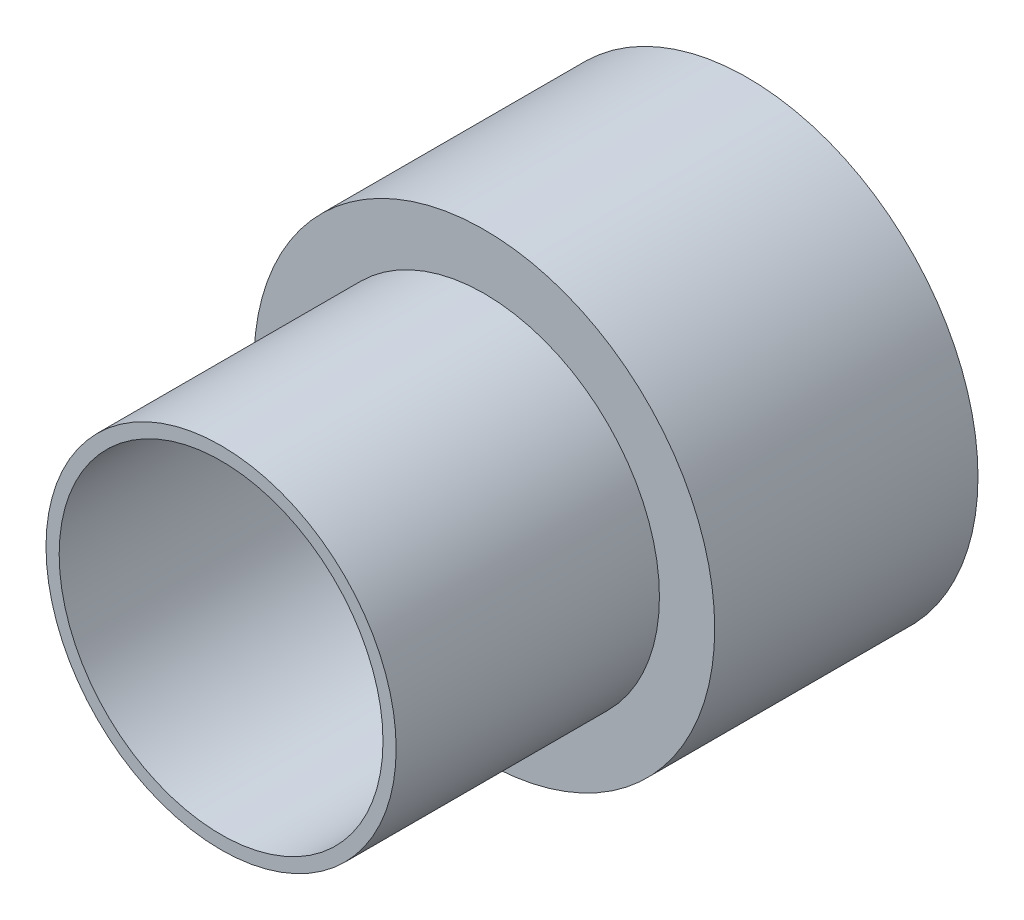
ISO-10303-21;
HEADER;
FILE_DESCRIPTION(('STEP AP214'),'2;1');
FILE_NAME('part.step','',(''),(''),'','','');
FILE_SCHEMA(('AUTOMOTIVE_DESIGN { 1 0 10303 214 1 1 1 1 }'));
ENDSEC;
DATA;
#1=APPLICATION_CONTEXT('core data for automotive mechanical design processes');
#2=APPLICATION_PROTOCOL_DEFINITION('international standard','automotive_design',2000,#1);
#3=PRODUCT_CONTEXT('',#1,'mechanical');
#4=PRODUCT('Part','Part','',(#3));
#5=PRODUCT_RELATED_PRODUCT_CATEGORY('part','',(#4));
#6=PRODUCT_DEFINITION_FORMATION('','',#4);
#7=PRODUCT_DEFINITION_CONTEXT('part definition',#1,'design');
#8=PRODUCT_DEFINITION('design','',#6,#7);
#9=PRODUCT_DEFINITION_SHAPE('','',#8);
#10=(LENGTH_UNIT() NAMED_UNIT(*) SI_UNIT(.MILLI.,.METRE.));
#11=(NAMED_UNIT(*) PLANE_ANGLE_UNIT() SI_UNIT($,.RADIAN.));
#12=(NAMED_UNIT(*) SI_UNIT($,.STERADIAN.) SOLID_ANGLE_UNIT());
#13=UNCERTAINTY_MEASURE_WITH_UNIT(LENGTH_MEASURE(1.E-05),#10,'distance_accuracy_value','');
#14=(GEOMETRIC_REPRESENTATION_CONTEXT(3) GLOBAL_UNCERTAINTY_ASSIGNED_CONTEXT((#13)) GLOBAL_UNIT_ASSIGNED_CONTEXT((#10,
#11,#12)) REPRESENTATION_CONTEXT('',''));
#15=CARTESIAN_POINT('',(0.,0.,0.));
#16=DIRECTION('',(0.,0.,1.));
#17=DIRECTION('',(1.,0.,0.));
#18=AXIS2_PLACEMENT_3D('',#15,#16,#17);
#19=CARTESIAN_POINT('',(0.,0.,0.));
#20=DIRECTION('',(0.,0.,1.));
#21=DIRECTION('',(1.,0.,0.));
#22=AXIS2_PLACEMENT_3D('',#19,#20,#21);
#23=CYLINDRICAL_SURFACE('',#22,15.621);
#24=CARTESIAN_POINT('',(0.,0.,50.8));
#25=DIRECTION('',(0.,0.,1.));
#26=DIRECTION('',(1.,0.,0.));
#27=AXIS2_PLACEMENT_3D('',#24,#25,#26);
#28=CIRCLE('',#27,15.621);
#29=CARTESIAN_POINT('',(15.621,0.,50.8));
#30=VERTEX_POINT('',#29);
#31=EDGE_CURVE('E49',#30,#30,#28,.T.);
#32=ORIENTED_EDGE('',*,*,#31,.T.);
#33=EDGE_LOOP('',(#32));
#34=FACE_BOUND('',#33,.T.);
#35=CARTESIAN_POINT('',(0.,0.,22.225));
#36=DIRECTION('',(0.,0.,-1.));
#37=DIRECTION('',(-1.,0.,0.));
#38=AXIS2_PLACEMENT_3D('',#35,#36,#37);
#39=CIRCLE('',#38,15.621);
#40=CARTESIAN_POINT('',(-15.621,0.,22.225));
#41=VERTEX_POINT('',#40);
#42=EDGE_CURVE('E35',#41,#41,#39,.F.);
#43=ORIENTED_EDGE('',*,*,#42,.F.);
#44=EDGE_LOOP('',(#43));
#45=FACE_BOUND('',#44,.T.);
#46=ADVANCED_FACE('F31',(#34,#45),#23,.F.);
#47=CARTESIAN_POINT('',(0.,0.,25.4));
#48=DIRECTION('',(0.,0.,-1.));
#49=DIRECTION('',(-1.,0.,0.));
#50=AXIS2_PLACEMENT_3D('',#47,#48,#49);
#51=CYLINDRICAL_SURFACE('',#50,22.225);
#52=CARTESIAN_POINT('',(0.,0.,25.4));
#53=DIRECTION('',(0.,0.,1.));
#54=DIRECTION('',(1.,0.,0.));
#55=AXIS2_PLACEMENT_3D('',#52,#53,#54);
#56=CIRCLE('',#55,22.225);
#57=CARTESIAN_POINT('',(22.225,0.,25.4));
#58=VERTEX_POINT('',#57);
#59=EDGE_CURVE('E10',#58,#58,#56,.T.);
#60=ORIENTED_EDGE('',*,*,#59,.F.);
#61=EDGE_LOOP('',(#60));
#62=FACE_BOUND('',#61,.T.);
#63=CARTESIAN_POINT('',(0.,0.,0.));
#64=DIRECTION('',(0.,0.,1.));
#65=DIRECTION('',(1.,0.,0.));
#66=AXIS2_PLACEMENT_3D('',#63,#64,#65);
#67=CIRCLE('',#66,22.225);
#68=CARTESIAN_POINT('',(22.225,0.,0.));
#69=VERTEX_POINT('',#68);
#70=EDGE_CURVE('E39',#69,#69,#67,.T.);
#71=ORIENTED_EDGE('',*,*,#70,.T.);
#72=EDGE_LOOP('',(#71));
#73=FACE_BOUND('',#72,.T.);
#74=ADVANCED_FACE('F33',(#62,#73),#51,.T.);
#75=CARTESIAN_POINT('',(0.,0.,25.4));
#76=DIRECTION('',(0.,0.,1.));
#77=DIRECTION('',(1.,0.,0.));
#78=AXIS2_PLACEMENT_3D('',#75,#76,#77);
#79=PLANE('',#78);
#80=CARTESIAN_POINT('',(0.,0.,25.4));
#81=DIRECTION('',(0.,0.,1.));
#82=DIRECTION('',(1.,0.,0.));
#83=AXIS2_PLACEMENT_3D('',#80,#81,#82);
#84=CIRCLE('',#83,16.891);
#85=CARTESIAN_POINT('',(16.891,0.,25.4));
#86=VERTEX_POINT('',#85);
#87=EDGE_CURVE('E46',#86,#86,#84,.T.);
#88=ORIENTED_EDGE('',*,*,#87,.F.);
#89=EDGE_LOOP('',(#88));
#90=FACE_BOUND('',#89,.T.);
#91=ORIENTED_EDGE('',*,*,#59,.T.);
#92=EDGE_LOOP('',(#91));
#93=FACE_BOUND('',#92,.T.);
#94=ADVANCED_FACE('F72',(#90,#93),#79,.T.);
#95=CARTESIAN_POINT('',(0.,0.,0.));
#96=DIRECTION('',(0.,0.,1.));
#97=DIRECTION('',(1.,0.,0.));
#98=AXIS2_PLACEMENT_3D('',#95,#96,#97);
#99=PLANE('',#98);
#100=CARTESIAN_POINT('',(0.,0.,0.));
#101=DIRECTION('',(0.,0.,-1.));
#102=DIRECTION('',(-1.,0.,0.));
#103=AXIS2_PLACEMENT_3D('',#100,#101,#102);
#104=CIRCLE('',#103,19.685);
#105=CARTESIAN_POINT('',(-19.685,0.,0.));
#106=VERTEX_POINT('',#105);
#107=EDGE_CURVE('E54',#106,#106,#104,.T.);
#108=ORIENTED_EDGE('',*,*,#107,.F.);
#109=EDGE_LOOP('',(#108));
#110=FACE_BOUND('',#109,.T.);
#111=ORIENTED_EDGE('',*,*,#70,.F.);
#112=EDGE_LOOP('',(#111));
#113=FACE_BOUND('',#112,.T.);
#114=ADVANCED_FACE('F85',(#110,#113),#99,.F.);
#115=CARTESIAN_POINT('',(0.,0.,50.8));
#116=DIRECTION('',(0.,0.,-1.));
#117=DIRECTION('',(-1.,0.,0.));
#118=AXIS2_PLACEMENT_3D('',#115,#116,#117);
#119=CYLINDRICAL_SURFACE('',#118,16.891);
#120=CARTESIAN_POINT('',(0.,0.,50.8));
#121=DIRECTION('',(0.,0.,1.));
#122=DIRECTION('',(1.,0.,0.));
#123=AXIS2_PLACEMENT_3D('',#120,#121,#122);
#124=CIRCLE('',#123,16.891);
#125=CARTESIAN_POINT('',(16.891,0.,50.8));
#126=VERTEX_POINT('',#125);
#127=EDGE_CURVE('E44',#126,#126,#124,.T.);
#128=ORIENTED_EDGE('',*,*,#127,.F.);
#129=EDGE_LOOP('',(#128));
#130=FACE_BOUND('',#129,.T.);
#131=ORIENTED_EDGE('',*,*,#87,.T.);
#132=EDGE_LOOP('',(#131));
#133=FACE_BOUND('',#132,.T.);
#134=ADVANCED_FACE('F81',(#130,#133),#119,.T.);
#135=CARTESIAN_POINT('',(0.,0.,50.8));
#136=DIRECTION('',(0.,0.,1.));
#137=DIRECTION('',(1.,0.,0.));
#138=AXIS2_PLACEMENT_3D('',#135,#136,#137);
#139=PLANE('',#138);
#140=ORIENTED_EDGE('',*,*,#31,.F.);
#141=EDGE_LOOP('',(#140));
#142=FACE_BOUND('',#141,.T.);
#143=ORIENTED_EDGE('',*,*,#127,.T.);
#144=EDGE_LOOP('',(#143));
#145=FACE_BOUND('',#144,.T.);
#146=ADVANCED_FACE('F78',(#142,#145),#139,.T.);
#147=CARTESIAN_POINT('',(0.,0.,22.225));
#148=DIRECTION('',(0.,0.,-1.));
#149=DIRECTION('',(-1.,0.,0.));
#150=AXIS2_PLACEMENT_3D('',#147,#148,#149);
#151=PLANE('',#150);
#152=CARTESIAN_POINT('',(0.,0.,22.225));
#153=DIRECTION('',(0.,0.,-1.));
#154=DIRECTION('',(-1.,0.,0.));
#155=AXIS2_PLACEMENT_3D('',#152,#153,#154);
#156=CIRCLE('',#155,19.685);
#157=CARTESIAN_POINT('',(-19.685,0.,22.225));
#158=VERTEX_POINT('',#157);
#159=EDGE_CURVE('E57',#158,#158,#156,.T.);
#160=ORIENTED_EDGE('',*,*,#159,.T.);
#161=EDGE_LOOP('',(#160));
#162=FACE_BOUND('',#161,.T.);
#163=ORIENTED_EDGE('',*,*,#42,.T.);
#164=EDGE_LOOP('',(#163));
#165=FACE_BOUND('',#164,.T.);
#166=ADVANCED_FACE('F64',(#162,#165),#151,.T.);
#167=CARTESIAN_POINT('',(0.,0.,22.225));
#168=DIRECTION('',(0.,0.,-1.));
#169=DIRECTION('',(-1.,0.,0.));
#170=AXIS2_PLACEMENT_3D('',#167,#168,#169);
#171=CYLINDRICAL_SURFACE('',#170,19.685);
#172=ORIENTED_EDGE('',*,*,#159,.F.);
#173=EDGE_LOOP('',(#172));
#174=FACE_BOUND('',#173,.T.);
#175=ORIENTED_EDGE('',*,*,#107,.T.);
#176=EDGE_LOOP('',(#175));
#177=FACE_BOUND('',#176,.T.);
#178=ADVANCED_FACE('F76',(#174,#177),#171,.F.);
#179=CLOSED_SHELL('',(#46,#74,#94,#114,#134,#146,#166,#178));
#180=MANIFOLD_SOLID_BREP('B2',#179);
#181=ADVANCED_BREP_SHAPE_REPRESENTATION('',(#18,#180),#14);
#182=SHAPE_DEFINITION_REPRESENTATION(#9,#181);
ENDSEC;
END-ISO-10303-21;
